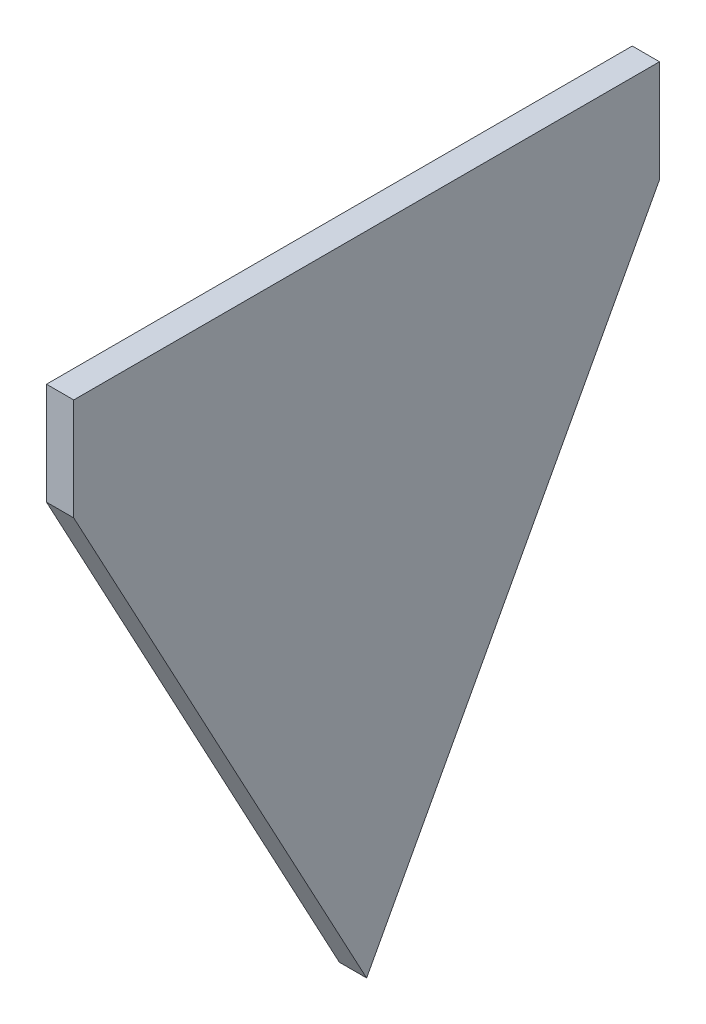
ISO-10303-21;
HEADER;
FILE_DESCRIPTION(('STEP AP214'),'2;1');
FILE_NAME('part.step','',(''),(''),'','','');
FILE_SCHEMA(('AUTOMOTIVE_DESIGN { 1 0 10303 214 1 1 1 1 }'));
ENDSEC;
DATA;
#1=APPLICATION_CONTEXT('core data for automotive mechanical design processes');
#2=APPLICATION_PROTOCOL_DEFINITION('international standard','automotive_design',2000,#1);
#3=PRODUCT_CONTEXT('',#1,'mechanical');
#4=PRODUCT('Part','Part','',(#3));
#5=PRODUCT_RELATED_PRODUCT_CATEGORY('part','',(#4));
#6=PRODUCT_DEFINITION_FORMATION('','',#4);
#7=PRODUCT_DEFINITION_CONTEXT('part definition',#1,'design');
#8=PRODUCT_DEFINITION('design','',#6,#7);
#9=PRODUCT_DEFINITION_SHAPE('','',#8);
#10=(LENGTH_UNIT() NAMED_UNIT(*) SI_UNIT(.MILLI.,.METRE.));
#11=(NAMED_UNIT(*) PLANE_ANGLE_UNIT() SI_UNIT($,.RADIAN.));
#12=(NAMED_UNIT(*) SI_UNIT($,.STERADIAN.) SOLID_ANGLE_UNIT());
#13=UNCERTAINTY_MEASURE_WITH_UNIT(LENGTH_MEASURE(1.E-05),#10,'distance_accuracy_value','');
#14=(GEOMETRIC_REPRESENTATION_CONTEXT(3) GLOBAL_UNCERTAINTY_ASSIGNED_CONTEXT((#13)) GLOBAL_UNIT_ASSIGNED_CONTEXT((#10,
#11,#12)) REPRESENTATION_CONTEXT('',''));
#15=CARTESIAN_POINT('',(0.,0.,0.));
#16=DIRECTION('',(0.,0.,1.));
#17=DIRECTION('',(1.,0.,0.));
#18=AXIS2_PLACEMENT_3D('',#15,#16,#17);
#19=CARTESIAN_POINT('',(4.,32.5,43.));
#20=DIRECTION('',(0.,0.,-1.));
#21=DIRECTION('',(-1.,0.,0.));
#22=AXIS2_PLACEMENT_3D('',#19,#20,#21);
#23=PLANE('',#22);
#24=DIRECTION('',(0.,-1.,0.));
#25=VECTOR('',#24,1.);
#26=CARTESIAN_POINT('',(0.,32.5,43.));
#27=LINE('',#26,#25);
#28=CARTESIAN_POINT('',(0.,47.5,43.));
#29=VERTEX_POINT('',#28);
#30=CARTESIAN_POINT('',(0.,32.5,43.));
#31=VERTEX_POINT('',#30);
#32=EDGE_CURVE('E107',#29,#31,#27,.T.);
#33=ORIENTED_EDGE('',*,*,#32,.T.);
#34=DIRECTION('',(-1.,0.,0.));
#35=VECTOR('',#34,1.);
#36=CARTESIAN_POINT('',(4.,32.5,43.));
#37=LINE('',#36,#35);
#38=CARTESIAN_POINT('',(4.,32.5,43.));
#39=VERTEX_POINT('',#38);
#40=EDGE_CURVE('E11',#39,#31,#37,.T.);
#41=ORIENTED_EDGE('',*,*,#40,.F.);
#42=DIRECTION('',(0.,-1.,0.));
#43=VECTOR('',#42,1.);
#44=CARTESIAN_POINT('',(4.,32.5,43.));
#45=LINE('',#44,#43);
#46=CARTESIAN_POINT('',(4.,47.5,43.));
#47=VERTEX_POINT('',#46);
#48=EDGE_CURVE('E115',#47,#39,#45,.T.);
#49=ORIENTED_EDGE('',*,*,#48,.F.);
#50=DIRECTION('',(-1.,0.,0.));
#51=VECTOR('',#50,1.);
#52=CARTESIAN_POINT('',(4.,47.5,43.));
#53=LINE('',#52,#51);
#54=EDGE_CURVE('E103',#47,#29,#53,.T.);
#55=ORIENTED_EDGE('',*,*,#54,.T.);
#56=EDGE_LOOP('',(#33,#41,#49,#55));
#57=FACE_BOUND('',#56,.T.);
#58=ADVANCED_FACE('F33',(#57),#23,.F.);
#59=CARTESIAN_POINT('',(4.,-47.5,0.));
#60=DIRECTION('',(0.,0.473443113395912,-0.880824397015651));
#61=DIRECTION('',(0.,0.880824397015651,0.473443113395912));
#62=AXIS2_PLACEMENT_3D('',#59,#60,#61);
#63=PLANE('',#62);
#64=DIRECTION('',(0.,-0.880824397015651,-0.473443113395912));
#65=VECTOR('',#64,1.);
#66=CARTESIAN_POINT('',(0.,-47.5,0.));
#67=LINE('',#66,#65);
#68=CARTESIAN_POINT('',(0.,-47.5,0.));
#69=VERTEX_POINT('',#68);
#70=EDGE_CURVE('E110',#31,#69,#67,.T.);
#71=ORIENTED_EDGE('',*,*,#70,.T.);
#72=DIRECTION('',(-1.,0.,0.));
#73=VECTOR('',#72,1.);
#74=CARTESIAN_POINT('',(4.,-47.5,0.));
#75=LINE('',#74,#73);
#76=CARTESIAN_POINT('',(4.,-47.5,0.));
#77=VERTEX_POINT('',#76);
#78=EDGE_CURVE('E41',#77,#69,#75,.T.);
#79=ORIENTED_EDGE('',*,*,#78,.F.);
#80=DIRECTION('',(0.,-0.880824397015651,-0.473443113395912));
#81=VECTOR('',#80,1.);
#82=CARTESIAN_POINT('',(4.,-47.5,0.));
#83=LINE('',#82,#81);
#84=EDGE_CURVE('E83',#39,#77,#83,.T.);
#85=ORIENTED_EDGE('',*,*,#84,.F.);
#86=ORIENTED_EDGE('',*,*,#40,.T.);
#87=EDGE_LOOP('',(#71,#79,#85,#86));
#88=FACE_BOUND('',#87,.T.);
#89=ADVANCED_FACE('F134',(#88),#63,.F.);
#90=CARTESIAN_POINT('',(4.,32.5,-43.));
#91=DIRECTION('',(0.,0.473443113395912,0.880824397015651));
#92=DIRECTION('',(0.,-0.880824397015651,0.473443113395912));
#93=AXIS2_PLACEMENT_3D('',#90,#91,#92);
#94=PLANE('',#93);
#95=DIRECTION('',(0.,0.880824397015651,-0.473443113395912));
#96=VECTOR('',#95,1.);
#97=CARTESIAN_POINT('',(0.,32.5,-43.));
#98=LINE('',#97,#96);
#99=CARTESIAN_POINT('',(0.,32.5,-43.));
#100=VERTEX_POINT('',#99);
#101=EDGE_CURVE('E98',#69,#100,#98,.T.);
#102=ORIENTED_EDGE('',*,*,#101,.T.);
#103=DIRECTION('',(-1.,0.,0.));
#104=VECTOR('',#103,1.);
#105=CARTESIAN_POINT('',(4.,32.5,-43.));
#106=LINE('',#105,#104);
#107=CARTESIAN_POINT('',(4.,32.5,-43.));
#108=VERTEX_POINT('',#107);
#109=EDGE_CURVE('E95',#108,#100,#106,.T.);
#110=ORIENTED_EDGE('',*,*,#109,.F.);
#111=DIRECTION('',(0.,0.880824397015651,-0.473443113395912));
#112=VECTOR('',#111,1.);
#113=CARTESIAN_POINT('',(4.,32.5,-43.));
#114=LINE('',#113,#112);
#115=EDGE_CURVE('E87',#77,#108,#114,.T.);
#116=ORIENTED_EDGE('',*,*,#115,.F.);
#117=ORIENTED_EDGE('',*,*,#78,.T.);
#118=EDGE_LOOP('',(#102,#110,#116,#117));
#119=FACE_BOUND('',#118,.T.);
#120=ADVANCED_FACE('F96',(#119),#94,.F.);
#121=CARTESIAN_POINT('',(4.,47.5,-43.));
#122=DIRECTION('',(0.,0.,1.));
#123=DIRECTION('',(1.,0.,0.));
#124=AXIS2_PLACEMENT_3D('',#121,#122,#123);
#125=PLANE('',#124);
#126=DIRECTION('',(0.,1.,0.));
#127=VECTOR('',#126,1.);
#128=CARTESIAN_POINT('',(0.,47.5,-43.));
#129=LINE('',#128,#127);
#130=CARTESIAN_POINT('',(0.,47.5,-43.));
#131=VERTEX_POINT('',#130);
#132=EDGE_CURVE('E69',#100,#131,#129,.T.);
#133=ORIENTED_EDGE('',*,*,#132,.T.);
#134=DIRECTION('',(-1.,0.,0.));
#135=VECTOR('',#134,1.);
#136=CARTESIAN_POINT('',(4.,47.5,-43.));
#137=LINE('',#136,#135);
#138=CARTESIAN_POINT('',(4.,47.5,-43.));
#139=VERTEX_POINT('',#138);
#140=EDGE_CURVE('E99',#139,#131,#137,.T.);
#141=ORIENTED_EDGE('',*,*,#140,.F.);
#142=DIRECTION('',(0.,1.,0.));
#143=VECTOR('',#142,1.);
#144=CARTESIAN_POINT('',(4.,47.5,-43.));
#145=LINE('',#144,#143);
#146=EDGE_CURVE('E91',#108,#139,#145,.T.);
#147=ORIENTED_EDGE('',*,*,#146,.F.);
#148=ORIENTED_EDGE('',*,*,#109,.T.);
#149=EDGE_LOOP('',(#133,#141,#147,#148));
#150=FACE_BOUND('',#149,.T.);
#151=ADVANCED_FACE('F101',(#150),#125,.F.);
#152=CARTESIAN_POINT('',(4.,47.5,43.));
#153=DIRECTION('',(0.,-1.,0.));
#154=DIRECTION('',(0.,0.,-1.));
#155=AXIS2_PLACEMENT_3D('',#152,#153,#154);
#156=PLANE('',#155);
#157=DIRECTION('',(0.,0.,1.));
#158=VECTOR('',#157,1.);
#159=CARTESIAN_POINT('',(0.,47.5,43.));
#160=LINE('',#159,#158);
#161=EDGE_CURVE('E75',#131,#29,#160,.T.);
#162=ORIENTED_EDGE('',*,*,#161,.T.);
#163=ORIENTED_EDGE('',*,*,#54,.F.);
#164=DIRECTION('',(0.,0.,1.));
#165=VECTOR('',#164,1.);
#166=CARTESIAN_POINT('',(4.,47.5,43.));
#167=LINE('',#166,#165);
#168=EDGE_CURVE('E49',#139,#47,#167,.T.);
#169=ORIENTED_EDGE('',*,*,#168,.F.);
#170=ORIENTED_EDGE('',*,*,#140,.T.);
#171=EDGE_LOOP('',(#162,#163,#169,#170));
#172=FACE_BOUND('',#171,.T.);
#173=ADVANCED_FACE('F123',(#172),#156,.F.);
#174=CARTESIAN_POINT('',(4.,0.,0.));
#175=DIRECTION('',(-1.,0.,0.));
#176=DIRECTION('',(0.,0.,1.));
#177=AXIS2_PLACEMENT_3D('',#174,#175,#176);
#178=PLANE('',#177);
#179=ORIENTED_EDGE('',*,*,#48,.T.);
#180=ORIENTED_EDGE('',*,*,#84,.T.);
#181=ORIENTED_EDGE('',*,*,#115,.T.);
#182=ORIENTED_EDGE('',*,*,#146,.T.);
#183=ORIENTED_EDGE('',*,*,#168,.T.);
#184=EDGE_LOOP('',(#179,#180,#181,#182,#183));
#185=FACE_BOUND('',#184,.T.);
#186=ADVANCED_FACE('F89',(#185),#178,.F.);
#187=CARTESIAN_POINT('',(0.,0.,0.));
#188=DIRECTION('',(-1.,0.,0.));
#189=DIRECTION('',(0.,0.,1.));
#190=AXIS2_PLACEMENT_3D('',#187,#188,#189);
#191=PLANE('',#190);
#192=ORIENTED_EDGE('',*,*,#32,.F.);
#193=ORIENTED_EDGE('',*,*,#161,.F.);
#194=ORIENTED_EDGE('',*,*,#132,.F.);
#195=ORIENTED_EDGE('',*,*,#101,.F.);
#196=ORIENTED_EDGE('',*,*,#70,.F.);
#197=EDGE_LOOP('',(#192,#193,#194,#195,#196));
#198=FACE_BOUND('',#197,.T.);
#199=ADVANCED_FACE('F119',(#198),#191,.T.);
#200=CLOSED_SHELL('',(#58,#89,#120,#151,#173,#186,#199));
#201=MANIFOLD_SOLID_BREP('B2',#200);
#202=ADVANCED_BREP_SHAPE_REPRESENTATION('',(#18,#201),#14);
#203=SHAPE_DEFINITION_REPRESENTATION(#9,#202);
ENDSEC;
END-ISO-10303-21;
